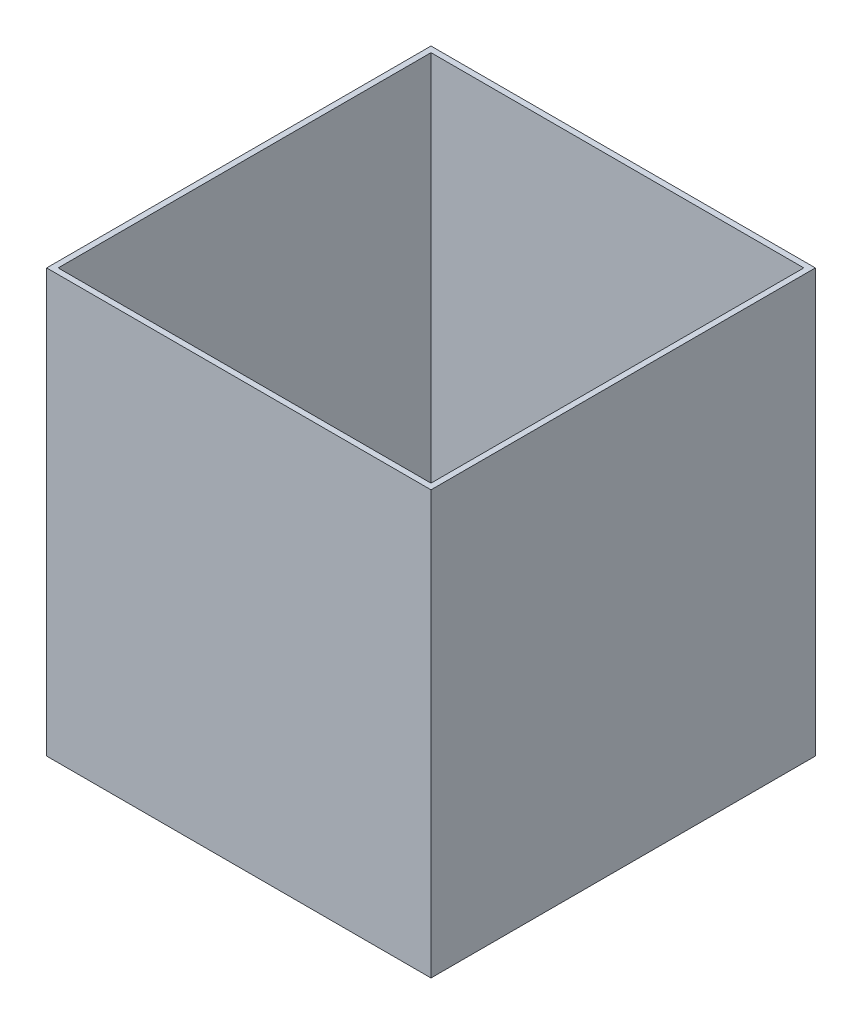
ISO-10303-21;
HEADER;
FILE_DESCRIPTION(('STEP AP214'),'2;1');
FILE_NAME('part.step','',(''),(''),'','','');
FILE_SCHEMA(('AUTOMOTIVE_DESIGN { 1 0 10303 214 1 1 1 1 }'));
ENDSEC;
DATA;
#1=APPLICATION_CONTEXT('core data for automotive mechanical design processes');
#2=APPLICATION_PROTOCOL_DEFINITION('international standard','automotive_design',2000,#1);
#3=PRODUCT_CONTEXT('',#1,'mechanical');
#4=PRODUCT('Part','Part','',(#3));
#5=PRODUCT_RELATED_PRODUCT_CATEGORY('part','',(#4));
#6=PRODUCT_DEFINITION_FORMATION('','',#4);
#7=PRODUCT_DEFINITION_CONTEXT('part definition',#1,'design');
#8=PRODUCT_DEFINITION('design','',#6,#7);
#9=PRODUCT_DEFINITION_SHAPE('','',#8);
#10=(LENGTH_UNIT() NAMED_UNIT(*) SI_UNIT(.MILLI.,.METRE.));
#11=(NAMED_UNIT(*) PLANE_ANGLE_UNIT() SI_UNIT($,.RADIAN.));
#12=(NAMED_UNIT(*) SI_UNIT($,.STERADIAN.) SOLID_ANGLE_UNIT());
#13=UNCERTAINTY_MEASURE_WITH_UNIT(LENGTH_MEASURE(1.E-05),#10,'distance_accuracy_value','');
#14=(GEOMETRIC_REPRESENTATION_CONTEXT(3) GLOBAL_UNCERTAINTY_ASSIGNED_CONTEXT((#13)) GLOBAL_UNIT_ASSIGNED_CONTEXT((#10,
#11,#12)) REPRESENTATION_CONTEXT('',''));
#15=CARTESIAN_POINT('',(0.,0.,0.));
#16=DIRECTION('',(0.,0.,1.));
#17=DIRECTION('',(1.,0.,0.));
#18=AXIS2_PLACEMENT_3D('',#15,#16,#17);
#19=CARTESIAN_POINT('',(0.,220.,0.));
#20=DIRECTION('',(0.,1.,0.));
#21=DIRECTION('',(0.,0.,1.));
#22=AXIS2_PLACEMENT_3D('',#19,#20,#21);
#23=PLANE('',#22);
#24=DIRECTION('',(0.,0.,-1.));
#25=VECTOR('',#24,1.);
#26=CARTESIAN_POINT('',(0.,220.,0.));
#27=LINE('',#26,#25);
#28=CARTESIAN_POINT('',(0.,220.,0.));
#29=VERTEX_POINT('',#28);
#30=CARTESIAN_POINT('',(0.,220.,-200.));
#31=VERTEX_POINT('',#30);
#32=EDGE_CURVE('E136',#29,#31,#27,.T.);
#33=ORIENTED_EDGE('',*,*,#32,.T.);
#34=DIRECTION('',(-1.,0.,0.));
#35=VECTOR('',#34,1.);
#36=CARTESIAN_POINT('',(0.,220.,-200.));
#37=LINE('',#36,#35);
#38=CARTESIAN_POINT('',(-200.,220.,-200.));
#39=VERTEX_POINT('',#38);
#40=EDGE_CURVE('E139',#31,#39,#37,.T.);
#41=ORIENTED_EDGE('',*,*,#40,.T.);
#42=DIRECTION('',(0.,0.,1.));
#43=VECTOR('',#42,1.);
#44=CARTESIAN_POINT('',(-200.,220.,0.));
#45=LINE('',#44,#43);
#46=CARTESIAN_POINT('',(-200.,220.,0.));
#47=VERTEX_POINT('',#46);
#48=EDGE_CURVE('E142',#39,#47,#45,.T.);
#49=ORIENTED_EDGE('',*,*,#48,.T.);
#50=DIRECTION('',(1.,0.,0.));
#51=VECTOR('',#50,1.);
#52=CARTESIAN_POINT('',(0.,220.,0.));
#53=LINE('',#52,#51);
#54=EDGE_CURVE('E144',#47,#29,#53,.T.);
#55=ORIENTED_EDGE('',*,*,#54,.T.);
#56=EDGE_LOOP('',(#33,#41,#49,#55));
#57=FACE_BOUND('',#56,.T.);
#58=DIRECTION('',(1.,0.,0.));
#59=VECTOR('',#58,1.);
#60=CARTESIAN_POINT('',(-197.,220.,-2.99999999999998));
#61=LINE('',#60,#59);
#62=CARTESIAN_POINT('',(-197.,220.,-2.99999999999998));
#63=VERTEX_POINT('',#62);
#64=CARTESIAN_POINT('',(-2.99999999999998,220.,-2.99999999999998));
#65=VERTEX_POINT('',#64);
#66=EDGE_CURVE('E108',#63,#65,#61,.T.);
#67=ORIENTED_EDGE('',*,*,#66,.F.);
#68=DIRECTION('',(0.,0.,1.));
#69=VECTOR('',#68,1.);
#70=CARTESIAN_POINT('',(-197.,220.,-197.));
#71=LINE('',#70,#69);
#72=CARTESIAN_POINT('',(-197.,220.,-197.));
#73=VERTEX_POINT('',#72);
#74=EDGE_CURVE('E100',#73,#63,#71,.T.);
#75=ORIENTED_EDGE('',*,*,#74,.F.);
#76=DIRECTION('',(-1.,0.,0.));
#77=VECTOR('',#76,1.);
#78=CARTESIAN_POINT('',(-197.,220.,-197.));
#79=LINE('',#78,#77);
#80=CARTESIAN_POINT('',(-3.,220.,-197.));
#81=VERTEX_POINT('',#80);
#82=EDGE_CURVE('E122',#81,#73,#79,.T.);
#83=ORIENTED_EDGE('',*,*,#82,.F.);
#84=DIRECTION('',(0.,0.,-1.));
#85=VECTOR('',#84,1.);
#86=CARTESIAN_POINT('',(-3.,220.,-197.));
#87=LINE('',#86,#85);
#88=EDGE_CURVE('E120',#65,#81,#87,.T.);
#89=ORIENTED_EDGE('',*,*,#88,.F.);
#90=EDGE_LOOP('',(#67,#75,#83,#89));
#91=FACE_BOUND('',#90,.T.);
#92=ADVANCED_FACE('F35',(#57,#91),#23,.T.);
#93=CARTESIAN_POINT('',(0.,0.,0.));
#94=DIRECTION('',(0.,1.,0.));
#95=DIRECTION('',(0.,0.,1.));
#96=AXIS2_PLACEMENT_3D('',#93,#94,#95);
#97=PLANE('',#96);
#98=DIRECTION('',(0.,0.,-1.));
#99=VECTOR('',#98,1.);
#100=CARTESIAN_POINT('',(0.,0.,0.));
#101=LINE('',#100,#99);
#102=CARTESIAN_POINT('',(0.,0.,0.));
#103=VERTEX_POINT('',#102);
#104=CARTESIAN_POINT('',(0.,0.,-200.));
#105=VERTEX_POINT('',#104);
#106=EDGE_CURVE('E116',#103,#105,#101,.T.);
#107=ORIENTED_EDGE('',*,*,#106,.F.);
#108=DIRECTION('',(1.,0.,0.));
#109=VECTOR('',#108,1.);
#110=CARTESIAN_POINT('',(0.,0.,0.));
#111=LINE('',#110,#109);
#112=CARTESIAN_POINT('',(-200.,0.,0.));
#113=VERTEX_POINT('',#112);
#114=EDGE_CURVE('E140',#113,#103,#111,.T.);
#115=ORIENTED_EDGE('',*,*,#114,.F.);
#116=DIRECTION('',(0.,0.,1.));
#117=VECTOR('',#116,1.);
#118=CARTESIAN_POINT('',(-200.,0.,0.));
#119=LINE('',#118,#117);
#120=CARTESIAN_POINT('',(-200.,0.,-200.));
#121=VERTEX_POINT('',#120);
#122=EDGE_CURVE('E151',#121,#113,#119,.T.);
#123=ORIENTED_EDGE('',*,*,#122,.F.);
#124=DIRECTION('',(-1.,0.,0.));
#125=VECTOR('',#124,1.);
#126=CARTESIAN_POINT('',(0.,0.,-200.));
#127=LINE('',#126,#125);
#128=EDGE_CURVE('E149',#105,#121,#127,.T.);
#129=ORIENTED_EDGE('',*,*,#128,.F.);
#130=EDGE_LOOP('',(#107,#115,#123,#129));
#131=FACE_BOUND('',#130,.T.);
#132=DIRECTION('',(0.,0.,1.));
#133=VECTOR('',#132,1.);
#134=CARTESIAN_POINT('',(-197.,0.,-197.));
#135=LINE('',#134,#133);
#136=CARTESIAN_POINT('',(-197.,0.,-197.));
#137=VERTEX_POINT('',#136);
#138=CARTESIAN_POINT('',(-197.,0.,-2.99999999999998));
#139=VERTEX_POINT('',#138);
#140=EDGE_CURVE('E58',#137,#139,#135,.T.);
#141=ORIENTED_EDGE('',*,*,#140,.T.);
#142=DIRECTION('',(1.,0.,0.));
#143=VECTOR('',#142,1.);
#144=CARTESIAN_POINT('',(-197.,0.,-2.99999999999998));
#145=LINE('',#144,#143);
#146=CARTESIAN_POINT('',(-2.99999999999998,0.,-2.99999999999998));
#147=VERTEX_POINT('',#146);
#148=EDGE_CURVE('E115',#139,#147,#145,.T.);
#149=ORIENTED_EDGE('',*,*,#148,.T.);
#150=DIRECTION('',(0.,0.,-1.));
#151=VECTOR('',#150,1.);
#152=CARTESIAN_POINT('',(-3.,0.,-197.));
#153=LINE('',#152,#151);
#154=CARTESIAN_POINT('',(-3.,0.,-197.));
#155=VERTEX_POINT('',#154);
#156=EDGE_CURVE('E128',#147,#155,#153,.T.);
#157=ORIENTED_EDGE('',*,*,#156,.T.);
#158=DIRECTION('',(-1.,0.,0.));
#159=VECTOR('',#158,1.);
#160=CARTESIAN_POINT('',(-197.,0.,-197.));
#161=LINE('',#160,#159);
#162=EDGE_CURVE('E109',#155,#137,#161,.T.);
#163=ORIENTED_EDGE('',*,*,#162,.T.);
#164=EDGE_LOOP('',(#141,#149,#157,#163));
#165=FACE_BOUND('',#164,.T.);
#166=ADVANCED_FACE('F169',(#131,#165),#97,.F.);
#167=CARTESIAN_POINT('',(0.,220.,0.));
#168=DIRECTION('',(-1.,0.,0.));
#169=DIRECTION('',(0.,0.,1.));
#170=AXIS2_PLACEMENT_3D('',#167,#168,#169);
#171=PLANE('',#170);
#172=ORIENTED_EDGE('',*,*,#106,.T.);
#173=DIRECTION('',(0.,-1.,0.));
#174=VECTOR('',#173,1.);
#175=CARTESIAN_POINT('',(0.,220.,-200.));
#176=LINE('',#175,#174);
#177=EDGE_CURVE('E11',#31,#105,#176,.T.);
#178=ORIENTED_EDGE('',*,*,#177,.F.);
#179=ORIENTED_EDGE('',*,*,#32,.F.);
#180=DIRECTION('',(0.,-1.,0.));
#181=VECTOR('',#180,1.);
#182=CARTESIAN_POINT('',(0.,220.,0.));
#183=LINE('',#182,#181);
#184=EDGE_CURVE('E146',#29,#103,#183,.T.);
#185=ORIENTED_EDGE('',*,*,#184,.T.);
#186=EDGE_LOOP('',(#172,#178,#179,#185));
#187=FACE_BOUND('',#186,.T.);
#188=ADVANCED_FACE('F37',(#187),#171,.F.);
#189=CARTESIAN_POINT('',(0.,220.,-200.));
#190=DIRECTION('',(0.,0.,1.));
#191=DIRECTION('',(1.,0.,0.));
#192=AXIS2_PLACEMENT_3D('',#189,#190,#191);
#193=PLANE('',#192);
#194=ORIENTED_EDGE('',*,*,#128,.T.);
#195=DIRECTION('',(0.,-1.,0.));
#196=VECTOR('',#195,1.);
#197=CARTESIAN_POINT('',(-200.,220.,-200.));
#198=LINE('',#197,#196);
#199=EDGE_CURVE('E43',#39,#121,#198,.T.);
#200=ORIENTED_EDGE('',*,*,#199,.F.);
#201=ORIENTED_EDGE('',*,*,#40,.F.);
#202=ORIENTED_EDGE('',*,*,#177,.T.);
#203=EDGE_LOOP('',(#194,#200,#201,#202));
#204=FACE_BOUND('',#203,.T.);
#205=ADVANCED_FACE('F179',(#204),#193,.F.);
#206=CARTESIAN_POINT('',(-200.,220.,0.));
#207=DIRECTION('',(1.,0.,0.));
#208=DIRECTION('',(0.,0.,-1.));
#209=AXIS2_PLACEMENT_3D('',#206,#207,#208);
#210=PLANE('',#209);
#211=ORIENTED_EDGE('',*,*,#122,.T.);
#212=DIRECTION('',(0.,-1.,0.));
#213=VECTOR('',#212,1.);
#214=CARTESIAN_POINT('',(-200.,220.,0.));
#215=LINE('',#214,#213);
#216=EDGE_CURVE('E156',#47,#113,#215,.T.);
#217=ORIENTED_EDGE('',*,*,#216,.F.);
#218=ORIENTED_EDGE('',*,*,#48,.F.);
#219=ORIENTED_EDGE('',*,*,#199,.T.);
#220=EDGE_LOOP('',(#211,#217,#218,#219));
#221=FACE_BOUND('',#220,.T.);
#222=ADVANCED_FACE('F163',(#221),#210,.F.);
#223=CARTESIAN_POINT('',(0.,220.,0.));
#224=DIRECTION('',(0.,0.,-1.));
#225=DIRECTION('',(-1.,0.,0.));
#226=AXIS2_PLACEMENT_3D('',#223,#224,#225);
#227=PLANE('',#226);
#228=ORIENTED_EDGE('',*,*,#114,.T.);
#229=ORIENTED_EDGE('',*,*,#184,.F.);
#230=ORIENTED_EDGE('',*,*,#54,.F.);
#231=ORIENTED_EDGE('',*,*,#216,.T.);
#232=EDGE_LOOP('',(#228,#229,#230,#231));
#233=FACE_BOUND('',#232,.T.);
#234=ADVANCED_FACE('F173',(#233),#227,.F.);
#235=CARTESIAN_POINT('',(-197.,220.,-197.));
#236=DIRECTION('',(1.,0.,0.));
#237=DIRECTION('',(0.,0.,-1.));
#238=AXIS2_PLACEMENT_3D('',#235,#236,#237);
#239=PLANE('',#238);
#240=ORIENTED_EDGE('',*,*,#140,.F.);
#241=DIRECTION('',(0.,-1.,0.));
#242=VECTOR('',#241,1.);
#243=CARTESIAN_POINT('',(-197.,220.,-197.));
#244=LINE('',#243,#242);
#245=EDGE_CURVE('E104',#73,#137,#244,.T.);
#246=ORIENTED_EDGE('',*,*,#245,.F.);
#247=ORIENTED_EDGE('',*,*,#74,.T.);
#248=DIRECTION('',(0.,-1.,0.));
#249=VECTOR('',#248,1.);
#250=CARTESIAN_POINT('',(-197.,220.,-2.99999999999998));
#251=LINE('',#250,#249);
#252=EDGE_CURVE('E103',#63,#139,#251,.T.);
#253=ORIENTED_EDGE('',*,*,#252,.T.);
#254=EDGE_LOOP('',(#240,#246,#247,#253));
#255=FACE_BOUND('',#254,.T.);
#256=ADVANCED_FACE('F102',(#255),#239,.T.);
#257=CARTESIAN_POINT('',(-197.,220.,-2.99999999999998));
#258=DIRECTION('',(0.,0.,-1.));
#259=DIRECTION('',(-1.,0.,0.));
#260=AXIS2_PLACEMENT_3D('',#257,#258,#259);
#261=PLANE('',#260);
#262=ORIENTED_EDGE('',*,*,#148,.F.);
#263=ORIENTED_EDGE('',*,*,#252,.F.);
#264=ORIENTED_EDGE('',*,*,#66,.T.);
#265=DIRECTION('',(0.,-1.,0.));
#266=VECTOR('',#265,1.);
#267=CARTESIAN_POINT('',(-2.99999999999998,220.,-2.99999999999998));
#268=LINE('',#267,#266);
#269=EDGE_CURVE('E117',#65,#147,#268,.T.);
#270=ORIENTED_EDGE('',*,*,#269,.T.);
#271=EDGE_LOOP('',(#262,#263,#264,#270));
#272=FACE_BOUND('',#271,.T.);
#273=ADVANCED_FACE('F112',(#272),#261,.T.);
#274=CARTESIAN_POINT('',(-3.,220.,-197.));
#275=DIRECTION('',(-1.,0.,0.));
#276=DIRECTION('',(0.,0.,1.));
#277=AXIS2_PLACEMENT_3D('',#274,#275,#276);
#278=PLANE('',#277);
#279=ORIENTED_EDGE('',*,*,#156,.F.);
#280=ORIENTED_EDGE('',*,*,#269,.F.);
#281=ORIENTED_EDGE('',*,*,#88,.T.);
#282=DIRECTION('',(0.,-1.,0.));
#283=VECTOR('',#282,1.);
#284=CARTESIAN_POINT('',(-3.,220.,-197.));
#285=LINE('',#284,#283);
#286=EDGE_CURVE('E50',#81,#155,#285,.T.);
#287=ORIENTED_EDGE('',*,*,#286,.T.);
#288=EDGE_LOOP('',(#279,#280,#281,#287));
#289=FACE_BOUND('',#288,.T.);
#290=ADVANCED_FACE('F202',(#289),#278,.T.);
#291=CARTESIAN_POINT('',(-197.,220.,-197.));
#292=DIRECTION('',(0.,0.,1.));
#293=DIRECTION('',(1.,0.,0.));
#294=AXIS2_PLACEMENT_3D('',#291,#292,#293);
#295=PLANE('',#294);
#296=ORIENTED_EDGE('',*,*,#162,.F.);
#297=ORIENTED_EDGE('',*,*,#286,.F.);
#298=ORIENTED_EDGE('',*,*,#82,.T.);
#299=ORIENTED_EDGE('',*,*,#245,.T.);
#300=EDGE_LOOP('',(#296,#297,#298,#299));
#301=FACE_BOUND('',#300,.T.);
#302=ADVANCED_FACE('F206',(#301),#295,.T.);
#303=CLOSED_SHELL('',(#92,#166,#188,#205,#222,#234,#256,#273,#290,#302));
#304=MANIFOLD_SOLID_BREP('B2',#303);
#305=ADVANCED_BREP_SHAPE_REPRESENTATION('',(#18,#304),#14);
#306=SHAPE_DEFINITION_REPRESENTATION(#9,#305);
ENDSEC;
END-ISO-10303-21;
